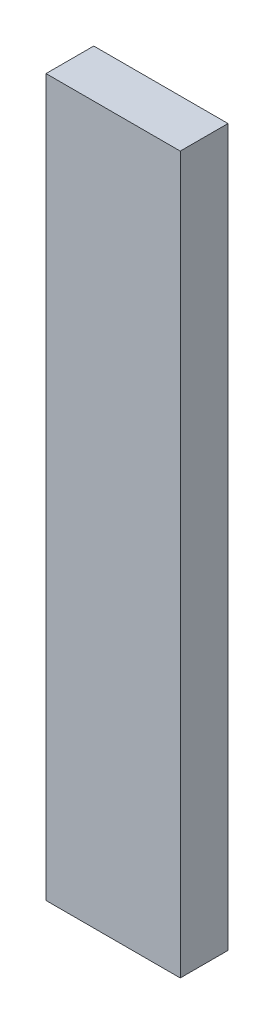
ISO-10303-21;
HEADER;
FILE_DESCRIPTION(('STEP AP214'),'2;1');
FILE_NAME('part.step','',(''),(''),'','','');
FILE_SCHEMA(('AUTOMOTIVE_DESIGN { 1 0 10303 214 1 1 1 1 }'));
ENDSEC;
DATA;
#1=APPLICATION_CONTEXT('core data for automotive mechanical design processes');
#2=APPLICATION_PROTOCOL_DEFINITION('international standard','automotive_design',2000,#1);
#3=PRODUCT_CONTEXT('',#1,'mechanical');
#4=PRODUCT('Part','Part','',(#3));
#5=PRODUCT_RELATED_PRODUCT_CATEGORY('part','',(#4));
#6=PRODUCT_DEFINITION_FORMATION('','',#4);
#7=PRODUCT_DEFINITION_CONTEXT('part definition',#1,'design');
#8=PRODUCT_DEFINITION('design','',#6,#7);
#9=PRODUCT_DEFINITION_SHAPE('','',#8);
#10=(LENGTH_UNIT() NAMED_UNIT(*) SI_UNIT(.MILLI.,.METRE.));
#11=(NAMED_UNIT(*) PLANE_ANGLE_UNIT() SI_UNIT($,.RADIAN.));
#12=(NAMED_UNIT(*) SI_UNIT($,.STERADIAN.) SOLID_ANGLE_UNIT());
#13=UNCERTAINTY_MEASURE_WITH_UNIT(LENGTH_MEASURE(1.E-05),#10,'distance_accuracy_value','');
#14=(GEOMETRIC_REPRESENTATION_CONTEXT(3) GLOBAL_UNCERTAINTY_ASSIGNED_CONTEXT((#13)) GLOBAL_UNIT_ASSIGNED_CONTEXT((#10,
#11,#12)) REPRESENTATION_CONTEXT('',''));
#15=CARTESIAN_POINT('',(0.,0.,0.));
#16=DIRECTION('',(0.,0.,1.));
#17=DIRECTION('',(1.,0.,0.));
#18=AXIS2_PLACEMENT_3D('',#15,#16,#17);
#19=CARTESIAN_POINT('',(11.248,60.,8.));
#20=DIRECTION('',(-1.,0.,0.));
#21=DIRECTION('',(0.,-1.,0.));
#22=AXIS2_PLACEMENT_3D('',#19,#20,#21);
#23=PLANE('',#22);
#24=DIRECTION('',(0.,1.,0.));
#25=VECTOR('',#24,1.);
#26=CARTESIAN_POINT('',(11.248,60.,0.));
#27=LINE('',#26,#25);
#28=CARTESIAN_POINT('',(11.248,-60.,0.));
#29=VERTEX_POINT('',#28);
#30=CARTESIAN_POINT('',(11.248,60.,0.));
#31=VERTEX_POINT('',#30);
#32=EDGE_CURVE('E107',#29,#31,#27,.T.);
#33=ORIENTED_EDGE('',*,*,#32,.T.);
#34=DIRECTION('',(0.,0.,-1.));
#35=VECTOR('',#34,1.);
#36=CARTESIAN_POINT('',(11.248,60.,8.));
#37=LINE('',#36,#35);
#38=CARTESIAN_POINT('',(11.248,60.,8.));
#39=VERTEX_POINT('',#38);
#40=EDGE_CURVE('E11',#39,#31,#37,.T.);
#41=ORIENTED_EDGE('',*,*,#40,.F.);
#42=DIRECTION('',(0.,1.,0.));
#43=VECTOR('',#42,1.);
#44=CARTESIAN_POINT('',(11.248,60.,8.));
#45=LINE('',#44,#43);
#46=CARTESIAN_POINT('',(11.248,-60.,8.));
#47=VERTEX_POINT('',#46);
#48=EDGE_CURVE('E91',#47,#39,#45,.T.);
#49=ORIENTED_EDGE('',*,*,#48,.F.);
#50=DIRECTION('',(0.,0.,-1.));
#51=VECTOR('',#50,1.);
#52=CARTESIAN_POINT('',(11.248,-60.,8.));
#53=LINE('',#52,#51);
#54=EDGE_CURVE('E103',#47,#29,#53,.T.);
#55=ORIENTED_EDGE('',*,*,#54,.T.);
#56=EDGE_LOOP('',(#33,#41,#49,#55));
#57=FACE_BOUND('',#56,.T.);
#58=ADVANCED_FACE('F39',(#57),#23,.F.);
#59=CARTESIAN_POINT('',(-11.248,60.,8.));
#60=DIRECTION('',(0.,-1.,0.));
#61=DIRECTION('',(0.,0.,-1.));
#62=AXIS2_PLACEMENT_3D('',#59,#60,#61);
#63=PLANE('',#62);
#64=DIRECTION('',(-1.,0.,0.));
#65=VECTOR('',#64,1.);
#66=CARTESIAN_POINT('',(-11.248,60.,0.));
#67=LINE('',#66,#65);
#68=CARTESIAN_POINT('',(-11.248,60.,0.));
#69=VERTEX_POINT('',#68);
#70=EDGE_CURVE('E96',#31,#69,#67,.T.);
#71=ORIENTED_EDGE('',*,*,#70,.T.);
#72=DIRECTION('',(0.,0.,-1.));
#73=VECTOR('',#72,1.);
#74=CARTESIAN_POINT('',(-11.248,60.,8.));
#75=LINE('',#74,#73);
#76=CARTESIAN_POINT('',(-11.248,60.,8.));
#77=VERTEX_POINT('',#76);
#78=EDGE_CURVE('E48',#77,#69,#75,.T.);
#79=ORIENTED_EDGE('',*,*,#78,.F.);
#80=DIRECTION('',(-1.,0.,0.));
#81=VECTOR('',#80,1.);
#82=CARTESIAN_POINT('',(-11.248,60.,8.));
#83=LINE('',#82,#81);
#84=EDGE_CURVE('E86',#39,#77,#83,.T.);
#85=ORIENTED_EDGE('',*,*,#84,.F.);
#86=ORIENTED_EDGE('',*,*,#40,.T.);
#87=EDGE_LOOP('',(#71,#79,#85,#86));
#88=FACE_BOUND('',#87,.T.);
#89=ADVANCED_FACE('F95',(#88),#63,.F.);
#90=CARTESIAN_POINT('',(-11.248,60.,8.));
#91=DIRECTION('',(1.,0.,0.));
#92=DIRECTION('',(0.,1.,0.));
#93=AXIS2_PLACEMENT_3D('',#90,#91,#92);
#94=PLANE('',#93);
#95=DIRECTION('',(0.,-1.,0.));
#96=VECTOR('',#95,1.);
#97=CARTESIAN_POINT('',(-11.248,60.,0.));
#98=LINE('',#97,#96);
#99=CARTESIAN_POINT('',(-11.248,-60.,0.));
#100=VERTEX_POINT('',#99);
#101=EDGE_CURVE('E73',#69,#100,#98,.T.);
#102=ORIENTED_EDGE('',*,*,#101,.T.);
#103=DIRECTION('',(0.,0.,-1.));
#104=VECTOR('',#103,1.);
#105=CARTESIAN_POINT('',(-11.248,-60.,8.));
#106=LINE('',#105,#104);
#107=CARTESIAN_POINT('',(-11.248,-60.,8.));
#108=VERTEX_POINT('',#107);
#109=EDGE_CURVE('E98',#108,#100,#106,.T.);
#110=ORIENTED_EDGE('',*,*,#109,.F.);
#111=DIRECTION('',(0.,-1.,0.));
#112=VECTOR('',#111,1.);
#113=CARTESIAN_POINT('',(-11.248,60.,8.));
#114=LINE('',#113,#112);
#115=EDGE_CURVE('E89',#77,#108,#114,.T.);
#116=ORIENTED_EDGE('',*,*,#115,.F.);
#117=ORIENTED_EDGE('',*,*,#78,.T.);
#118=EDGE_LOOP('',(#102,#110,#116,#117));
#119=FACE_BOUND('',#118,.T.);
#120=ADVANCED_FACE('F99',(#119),#94,.F.);
#121=CARTESIAN_POINT('',(-11.248,-60.,8.));
#122=DIRECTION('',(0.,1.,0.));
#123=DIRECTION('',(0.,0.,1.));
#124=AXIS2_PLACEMENT_3D('',#121,#122,#123);
#125=PLANE('',#124);
#126=DIRECTION('',(1.,0.,0.));
#127=VECTOR('',#126,1.);
#128=CARTESIAN_POINT('',(-11.248,-60.,0.));
#129=LINE('',#128,#127);
#130=EDGE_CURVE('E79',#100,#29,#129,.T.);
#131=ORIENTED_EDGE('',*,*,#130,.T.);
#132=ORIENTED_EDGE('',*,*,#54,.F.);
#133=DIRECTION('',(1.,0.,0.));
#134=VECTOR('',#133,1.);
#135=CARTESIAN_POINT('',(-11.248,-60.,8.));
#136=LINE('',#135,#134);
#137=EDGE_CURVE('E56',#108,#47,#136,.T.);
#138=ORIENTED_EDGE('',*,*,#137,.F.);
#139=ORIENTED_EDGE('',*,*,#109,.T.);
#140=EDGE_LOOP('',(#131,#132,#138,#139));
#141=FACE_BOUND('',#140,.T.);
#142=ADVANCED_FACE('F120',(#141),#125,.F.);
#143=CARTESIAN_POINT('',(0.,0.,8.));
#144=DIRECTION('',(0.,0.,1.));
#145=DIRECTION('',(1.,0.,0.));
#146=AXIS2_PLACEMENT_3D('',#143,#144,#145);
#147=PLANE('',#146);
#148=ORIENTED_EDGE('',*,*,#48,.T.);
#149=ORIENTED_EDGE('',*,*,#84,.T.);
#150=ORIENTED_EDGE('',*,*,#115,.T.);
#151=ORIENTED_EDGE('',*,*,#137,.T.);
#152=EDGE_LOOP('',(#148,#149,#150,#151));
#153=FACE_BOUND('',#152,.T.);
#154=ADVANCED_FACE('F87',(#153),#147,.T.);
#155=CARTESIAN_POINT('',(0.,0.,0.));
#156=DIRECTION('',(0.,0.,1.));
#157=DIRECTION('',(1.,0.,0.));
#158=AXIS2_PLACEMENT_3D('',#155,#156,#157);
#159=PLANE('',#158);
#160=ORIENTED_EDGE('',*,*,#32,.F.);
#161=ORIENTED_EDGE('',*,*,#130,.F.);
#162=ORIENTED_EDGE('',*,*,#101,.F.);
#163=ORIENTED_EDGE('',*,*,#70,.F.);
#164=EDGE_LOOP('',(#160,#161,#162,#163));
#165=FACE_BOUND('',#164,.T.);
#166=ADVANCED_FACE('F123',(#165),#159,.F.);
#167=CLOSED_SHELL('',(#58,#89,#120,#142,#154,#166));
#168=MANIFOLD_SOLID_BREP('B2',#167);
#169=ADVANCED_BREP_SHAPE_REPRESENTATION('',(#18,#168),#14);
#170=SHAPE_DEFINITION_REPRESENTATION(#9,#169);
ENDSEC;
END-ISO-10303-21;
